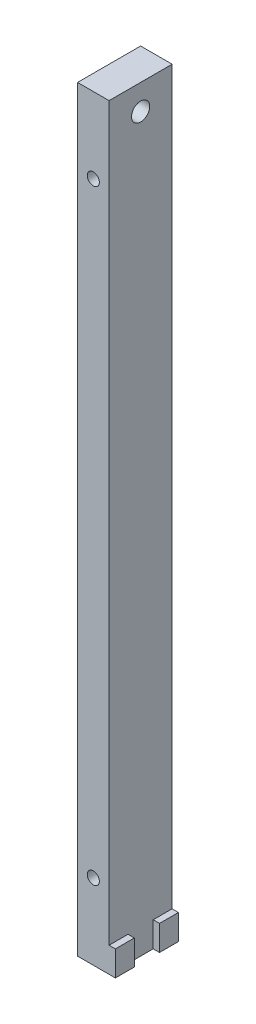
ISO-10303-21;
HEADER;
FILE_DESCRIPTION(('STEP AP214'),'2;1');
FILE_NAME('part.step','',(''),(''),'','','');
FILE_SCHEMA(('AUTOMOTIVE_DESIGN { 1 0 10303 214 1 1 1 1 }'));
ENDSEC;
DATA;
#1=APPLICATION_CONTEXT('core data for automotive mechanical design processes');
#2=APPLICATION_PROTOCOL_DEFINITION('international standard','automotive_design',2000,#1);
#3=PRODUCT_CONTEXT('',#1,'mechanical');
#4=PRODUCT('Part','Part','',(#3));
#5=PRODUCT_RELATED_PRODUCT_CATEGORY('part','',(#4));
#6=PRODUCT_DEFINITION_FORMATION('','',#4);
#7=PRODUCT_DEFINITION_CONTEXT('part definition',#1,'design');
#8=PRODUCT_DEFINITION('design','',#6,#7);
#9=PRODUCT_DEFINITION_SHAPE('','',#8);
#10=(LENGTH_UNIT() NAMED_UNIT(*) SI_UNIT(.MILLI.,.METRE.));
#11=(NAMED_UNIT(*) PLANE_ANGLE_UNIT() SI_UNIT($,.RADIAN.));
#12=(NAMED_UNIT(*) SI_UNIT($,.STERADIAN.) SOLID_ANGLE_UNIT());
#13=UNCERTAINTY_MEASURE_WITH_UNIT(LENGTH_MEASURE(1.E-05),#10,'distance_accuracy_value','');
#14=(GEOMETRIC_REPRESENTATION_CONTEXT(3) GLOBAL_UNCERTAINTY_ASSIGNED_CONTEXT((#13)) GLOBAL_UNIT_ASSIGNED_CONTEXT((#10,
#11,#12)) REPRESENTATION_CONTEXT('',''));
#15=CARTESIAN_POINT('',(0.,0.,0.));
#16=DIRECTION('',(0.,0.,1.));
#17=DIRECTION('',(1.,0.,0.));
#18=AXIS2_PLACEMENT_3D('',#15,#16,#17);
#19=CARTESIAN_POINT('',(9.525,190.5,15.875));
#20=DIRECTION('',(-1.,0.,0.));
#21=DIRECTION('',(0.,0.,1.));
#22=AXIS2_PLACEMENT_3D('',#19,#20,#21);
#23=PLANE('',#22);
#24=DIRECTION('',(0.,0.,1.));
#25=VECTOR('',#24,1.);
#26=CARTESIAN_POINT('',(9.525,6.35,15.875));
#27=LINE('',#26,#25);
#28=CARTESIAN_POINT('',(9.525,6.35,11.1125));
#29=VERTEX_POINT('',#28);
#30=CARTESIAN_POINT('',(9.525,6.35,15.875));
#31=VERTEX_POINT('',#30);
#32=EDGE_CURVE('E188',#29,#31,#27,.T.);
#33=ORIENTED_EDGE('',*,*,#32,.T.);
#34=DIRECTION('',(0.,-1.,0.));
#35=VECTOR('',#34,1.);
#36=CARTESIAN_POINT('',(9.525,190.5,15.875));
#37=LINE('',#36,#35);
#38=CARTESIAN_POINT('',(9.525,0.,15.875));
#39=VERTEX_POINT('',#38);
#40=EDGE_CURVE('E167',#31,#39,#37,.T.);
#41=ORIENTED_EDGE('',*,*,#40,.T.);
#42=DIRECTION('',(0.,0.,-1.));
#43=VECTOR('',#42,1.);
#44=CARTESIAN_POINT('',(9.525,0.,15.875));
#45=LINE('',#44,#43);
#46=CARTESIAN_POINT('',(9.525,0.,11.1125));
#47=VERTEX_POINT('',#46);
#48=EDGE_CURVE('E142',#39,#47,#45,.T.);
#49=ORIENTED_EDGE('',*,*,#48,.T.);
#50=DIRECTION('',(0.,-1.,0.));
#51=VECTOR('',#50,1.);
#52=CARTESIAN_POINT('',(9.525,190.5,11.1125));
#53=LINE('',#52,#51);
#54=EDGE_CURVE('E164',#29,#47,#53,.T.);
#55=ORIENTED_EDGE('',*,*,#54,.F.);
#56=EDGE_LOOP('',(#33,#41,#49,#55));
#57=FACE_BOUND('',#56,.T.);
#58=ADVANCED_FACE('F42',(#57),#23,.F.);
#59=CARTESIAN_POINT('',(9.525,190.5,11.1125));
#60=DIRECTION('',(0.,0.,1.));
#61=DIRECTION('',(1.,0.,0.));
#62=AXIS2_PLACEMENT_3D('',#59,#60,#61);
#63=PLANE('',#62);
#64=DIRECTION('',(-1.,0.,0.));
#65=VECTOR('',#64,1.);
#66=CARTESIAN_POINT('',(9.525,6.34999999999999,11.1125));
#67=LINE('',#66,#65);
#68=CARTESIAN_POINT('',(7.9375,6.35,11.1125));
#69=VERTEX_POINT('',#68);
#70=EDGE_CURVE('E127',#29,#69,#67,.T.);
#71=ORIENTED_EDGE('',*,*,#70,.F.);
#72=ORIENTED_EDGE('',*,*,#54,.T.);
#73=DIRECTION('',(-1.,0.,0.));
#74=VECTOR('',#73,1.);
#75=CARTESIAN_POINT('',(9.525,0.,11.1125));
#76=LINE('',#75,#74);
#77=CARTESIAN_POINT('',(7.9375,0.,11.1125));
#78=VERTEX_POINT('',#77);
#79=EDGE_CURVE('E146',#47,#78,#76,.T.);
#80=ORIENTED_EDGE('',*,*,#79,.T.);
#81=DIRECTION('',(0.,-1.,0.));
#82=VECTOR('',#81,1.);
#83=CARTESIAN_POINT('',(7.9375,190.5,11.1125));
#84=LINE('',#83,#82);
#85=EDGE_CURVE('E161',#69,#78,#84,.T.);
#86=ORIENTED_EDGE('',*,*,#85,.F.);
#87=EDGE_LOOP('',(#71,#72,#80,#86));
#88=FACE_BOUND('',#87,.T.);
#89=ADVANCED_FACE('F215',(#88),#63,.F.);
#90=CARTESIAN_POINT('',(7.9375,190.5,4.7625));
#91=DIRECTION('',(0.,0.,-1.));
#92=DIRECTION('',(-1.,0.,0.));
#93=AXIS2_PLACEMENT_3D('',#90,#91,#92);
#94=PLANE('',#93);
#95=DIRECTION('',(1.,0.,0.));
#96=VECTOR('',#95,1.);
#97=CARTESIAN_POINT('',(7.9375,6.34999999999999,4.7625));
#98=LINE('',#97,#96);
#99=CARTESIAN_POINT('',(7.9375,6.35,4.7625));
#100=VERTEX_POINT('',#99);
#101=CARTESIAN_POINT('',(9.525,6.35,4.7625));
#102=VERTEX_POINT('',#101);
#103=EDGE_CURVE('E134',#100,#102,#98,.T.);
#104=ORIENTED_EDGE('',*,*,#103,.F.);
#105=DIRECTION('',(0.,-1.,0.));
#106=VECTOR('',#105,1.);
#107=CARTESIAN_POINT('',(7.9375,190.5,4.7625));
#108=LINE('',#107,#106);
#109=CARTESIAN_POINT('',(7.9375,0.,4.7625));
#110=VERTEX_POINT('',#109);
#111=EDGE_CURVE('E158',#100,#110,#108,.T.);
#112=ORIENTED_EDGE('',*,*,#111,.T.);
#113=DIRECTION('',(1.,0.,0.));
#114=VECTOR('',#113,1.);
#115=CARTESIAN_POINT('',(7.9375,0.,4.7625));
#116=LINE('',#115,#114);
#117=CARTESIAN_POINT('',(9.525,0.,4.7625));
#118=VERTEX_POINT('',#117);
#119=EDGE_CURVE('E121',#110,#118,#116,.T.);
#120=ORIENTED_EDGE('',*,*,#119,.T.);
#121=DIRECTION('',(0.,-1.,0.));
#122=VECTOR('',#121,1.);
#123=CARTESIAN_POINT('',(9.525,190.5,4.7625));
#124=LINE('',#123,#122);
#125=EDGE_CURVE('E110',#102,#118,#124,.T.);
#126=ORIENTED_EDGE('',*,*,#125,.F.);
#127=EDGE_LOOP('',(#104,#112,#120,#126));
#128=FACE_BOUND('',#127,.T.);
#129=ADVANCED_FACE('F272',(#128),#94,.F.);
#130=CARTESIAN_POINT('',(9.525,190.5,4.7625));
#131=DIRECTION('',(-1.,0.,0.));
#132=DIRECTION('',(0.,0.,1.));
#133=AXIS2_PLACEMENT_3D('',#130,#131,#132);
#134=PLANE('',#133);
#135=CARTESIAN_POINT('',(9.525,6.35,0.));
#136=VERTEX_POINT('',#135);
#137=EDGE_CURVE('E211',#136,#102,#27,.T.);
#138=ORIENTED_EDGE('',*,*,#137,.T.);
#139=ORIENTED_EDGE('',*,*,#125,.T.);
#140=DIRECTION('',(0.,0.,-1.));
#141=VECTOR('',#140,1.);
#142=CARTESIAN_POINT('',(9.525,0.,4.7625));
#143=LINE('',#142,#141);
#144=CARTESIAN_POINT('',(9.525,0.,0.));
#145=VERTEX_POINT('',#144);
#146=EDGE_CURVE('E113',#118,#145,#143,.T.);
#147=ORIENTED_EDGE('',*,*,#146,.T.);
#148=DIRECTION('',(0.,-1.,0.));
#149=VECTOR('',#148,1.);
#150=CARTESIAN_POINT('',(9.525,190.5,0.));
#151=LINE('',#150,#149);
#152=EDGE_CURVE('E97',#136,#145,#151,.T.);
#153=ORIENTED_EDGE('',*,*,#152,.F.);
#154=EDGE_LOOP('',(#138,#139,#147,#153));
#155=FACE_BOUND('',#154,.T.);
#156=ADVANCED_FACE('F114',(#155),#134,.F.);
#157=CARTESIAN_POINT('',(9.525,190.5,0.));
#158=DIRECTION('',(0.,0.,1.));
#159=DIRECTION('',(1.,0.,0.));
#160=AXIS2_PLACEMENT_3D('',#157,#158,#159);
#161=PLANE('',#160);
#162=CARTESIAN_POINT('',(3.96875,19.05,0.));
#163=DIRECTION('',(0.,0.,1.));
#164=DIRECTION('',(1.,0.,0.));
#165=AXIS2_PLACEMENT_3D('',#162,#163,#164);
#166=CIRCLE('',#165,1.524);
#167=CARTESIAN_POINT('',(5.49275,19.05,0.));
#168=VERTEX_POINT('',#167);
#169=EDGE_CURVE('E239',#168,#168,#166,.T.);
#170=ORIENTED_EDGE('',*,*,#169,.T.);
#171=EDGE_LOOP('',(#170));
#172=FACE_BOUND('',#171,.T.);
#173=CARTESIAN_POINT('',(3.96875,171.45,0.));
#174=DIRECTION('',(0.,0.,1.));
#175=DIRECTION('',(1.,0.,0.));
#176=AXIS2_PLACEMENT_3D('',#173,#174,#175);
#177=CIRCLE('',#176,1.524);
#178=CARTESIAN_POINT('',(5.49275,171.45,0.));
#179=VERTEX_POINT('',#178);
#180=EDGE_CURVE('E311',#179,#179,#177,.T.);
#181=ORIENTED_EDGE('',*,*,#180,.T.);
#182=EDGE_LOOP('',(#181));
#183=FACE_BOUND('',#182,.T.);
#184=DIRECTION('',(-1.,0.,0.));
#185=VECTOR('',#184,1.);
#186=CARTESIAN_POINT('',(9.525,190.5,0.));
#187=LINE('',#186,#185);
#188=CARTESIAN_POINT('',(7.9375,190.5,0.));
#189=VERTEX_POINT('',#188);
#190=CARTESIAN_POINT('',(0.,190.5,0.));
#191=VERTEX_POINT('',#190);
#192=EDGE_CURVE('E120',#189,#191,#187,.T.);
#193=ORIENTED_EDGE('',*,*,#192,.F.);
#194=DIRECTION('',(0.,1.,0.));
#195=VECTOR('',#194,1.);
#196=CARTESIAN_POINT('',(7.9375,-15.9541775485294,0.));
#197=LINE('',#196,#195);
#198=CARTESIAN_POINT('',(7.9375,6.35,0.));
#199=VERTEX_POINT('',#198);
#200=EDGE_CURVE('E236',#199,#189,#197,.T.);
#201=ORIENTED_EDGE('',*,*,#200,.F.);
#202=DIRECTION('',(1.,0.,0.));
#203=VECTOR('',#202,1.);
#204=CARTESIAN_POINT('',(9.525,6.35,0.));
#205=LINE('',#204,#203);
#206=EDGE_CURVE('E106',#199,#136,#205,.T.);
#207=ORIENTED_EDGE('',*,*,#206,.T.);
#208=ORIENTED_EDGE('',*,*,#152,.T.);
#209=DIRECTION('',(-1.,0.,0.));
#210=VECTOR('',#209,1.);
#211=CARTESIAN_POINT('',(9.525,0.,0.));
#212=LINE('',#211,#210);
#213=CARTESIAN_POINT('',(0.,0.,0.));
#214=VERTEX_POINT('',#213);
#215=EDGE_CURVE('E102',#145,#214,#212,.T.);
#216=ORIENTED_EDGE('',*,*,#215,.T.);
#217=DIRECTION('',(0.,-1.,0.));
#218=VECTOR('',#217,1.);
#219=CARTESIAN_POINT('',(0.,190.5,0.));
#220=LINE('',#219,#218);
#221=EDGE_CURVE('E12',#191,#214,#220,.T.);
#222=ORIENTED_EDGE('',*,*,#221,.F.);
#223=EDGE_LOOP('',(#193,#201,#207,#208,#216,#222));
#224=FACE_BOUND('',#223,.T.);
#225=ADVANCED_FACE('F44',(#172,#183,#224),#161,.F.);
#226=CARTESIAN_POINT('',(0.,190.5,0.));
#227=DIRECTION('',(1.,0.,0.));
#228=DIRECTION('',(0.,0.,-1.));
#229=AXIS2_PLACEMENT_3D('',#226,#227,#228);
#230=PLANE('',#229);
#231=CARTESIAN_POINT('',(0.,184.15,7.9375));
#232=DIRECTION('',(-1.,0.,0.));
#233=DIRECTION('',(0.,0.,1.));
#234=AXIS2_PLACEMENT_3D('',#231,#232,#233);
#235=CIRCLE('',#234,2.286);
#236=CARTESIAN_POINT('',(0.,184.15,10.2235));
#237=VERTEX_POINT('',#236);
#238=EDGE_CURVE('E304',#237,#237,#235,.T.);
#239=ORIENTED_EDGE('',*,*,#238,.F.);
#240=EDGE_LOOP('',(#239));
#241=FACE_BOUND('',#240,.T.);
#242=DIRECTION('',(0.,0.,1.));
#243=VECTOR('',#242,1.);
#244=CARTESIAN_POINT('',(0.,0.,0.));
#245=LINE('',#244,#243);
#246=CARTESIAN_POINT('',(0.,0.,15.875));
#247=VERTEX_POINT('',#246);
#248=EDGE_CURVE('E125',#214,#247,#245,.T.);
#249=ORIENTED_EDGE('',*,*,#248,.T.);
#250=DIRECTION('',(0.,-1.,0.));
#251=VECTOR('',#250,1.);
#252=CARTESIAN_POINT('',(0.,190.5,15.875));
#253=LINE('',#252,#251);
#254=CARTESIAN_POINT('',(0.,190.5,15.875));
#255=VERTEX_POINT('',#254);
#256=EDGE_CURVE('E52',#255,#247,#253,.T.);
#257=ORIENTED_EDGE('',*,*,#256,.F.);
#258=DIRECTION('',(0.,0.,1.));
#259=VECTOR('',#258,1.);
#260=CARTESIAN_POINT('',(0.,190.5,0.));
#261=LINE('',#260,#259);
#262=EDGE_CURVE('E65',#191,#255,#261,.T.);
#263=ORIENTED_EDGE('',*,*,#262,.F.);
#264=ORIENTED_EDGE('',*,*,#221,.T.);
#265=EDGE_LOOP('',(#249,#257,#263,#264));
#266=FACE_BOUND('',#265,.T.);
#267=ADVANCED_FACE('F256',(#241,#266),#230,.F.);
#268=CARTESIAN_POINT('',(0.,190.5,15.875));
#269=DIRECTION('',(0.,0.,-1.));
#270=DIRECTION('',(-1.,0.,0.));
#271=AXIS2_PLACEMENT_3D('',#268,#269,#270);
#272=PLANE('',#271);
#273=CARTESIAN_POINT('',(3.96875,19.05,15.875));
#274=DIRECTION('',(0.,0.,1.));
#275=DIRECTION('',(1.,0.,0.));
#276=AXIS2_PLACEMENT_3D('',#273,#274,#275);
#277=CIRCLE('',#276,1.524);
#278=CARTESIAN_POINT('',(5.49275,19.05,15.875));
#279=VERTEX_POINT('',#278);
#280=EDGE_CURVE('E317',#279,#279,#277,.T.);
#281=ORIENTED_EDGE('',*,*,#280,.F.);
#282=EDGE_LOOP('',(#281));
#283=FACE_BOUND('',#282,.T.);
#284=CARTESIAN_POINT('',(3.96875,171.45,15.875));
#285=DIRECTION('',(0.,0.,1.));
#286=DIRECTION('',(1.,0.,0.));
#287=AXIS2_PLACEMENT_3D('',#284,#285,#286);
#288=CIRCLE('',#287,1.524);
#289=CARTESIAN_POINT('',(5.49275,171.45,15.875));
#290=VERTEX_POINT('',#289);
#291=EDGE_CURVE('E230',#290,#290,#288,.T.);
#292=ORIENTED_EDGE('',*,*,#291,.F.);
#293=EDGE_LOOP('',(#292));
#294=FACE_BOUND('',#293,.T.);
#295=DIRECTION('',(-1.,0.,0.));
#296=VECTOR('',#295,1.);
#297=CARTESIAN_POINT('',(9.525,6.35,15.875));
#298=LINE('',#297,#296);
#299=CARTESIAN_POINT('',(7.9375,6.35,15.875));
#300=VERTEX_POINT('',#299);
#301=EDGE_CURVE('E191',#31,#300,#298,.T.);
#302=ORIENTED_EDGE('',*,*,#301,.T.);
#303=DIRECTION('',(0.,1.,0.));
#304=VECTOR('',#303,1.);
#305=CARTESIAN_POINT('',(7.9375,-15.9541775485294,15.875));
#306=LINE('',#305,#304);
#307=CARTESIAN_POINT('',(7.9375,190.5,15.875));
#308=VERTEX_POINT('',#307);
#309=EDGE_CURVE('E221',#300,#308,#306,.T.);
#310=ORIENTED_EDGE('',*,*,#309,.T.);
#311=DIRECTION('',(1.,0.,0.));
#312=VECTOR('',#311,1.);
#313=CARTESIAN_POINT('',(0.,190.5,15.875));
#314=LINE('',#313,#312);
#315=EDGE_CURVE('E179',#255,#308,#314,.T.);
#316=ORIENTED_EDGE('',*,*,#315,.F.);
#317=ORIENTED_EDGE('',*,*,#256,.T.);
#318=DIRECTION('',(1.,0.,0.));
#319=VECTOR('',#318,1.);
#320=CARTESIAN_POINT('',(0.,0.,15.875));
#321=LINE('',#320,#319);
#322=EDGE_CURVE('E131',#247,#39,#321,.T.);
#323=ORIENTED_EDGE('',*,*,#322,.T.);
#324=ORIENTED_EDGE('',*,*,#40,.F.);
#325=EDGE_LOOP('',(#302,#310,#316,#317,#323,#324));
#326=FACE_BOUND('',#325,.T.);
#327=ADVANCED_FACE('F175',(#283,#294,#326),#272,.F.);
#328=CARTESIAN_POINT('',(7.9375,190.5,11.1125));
#329=DIRECTION('',(-1.,0.,0.));
#330=DIRECTION('',(0.,0.,1.));
#331=AXIS2_PLACEMENT_3D('',#328,#329,#330);
#332=PLANE('',#331);
#333=CARTESIAN_POINT('',(7.9375,184.15,7.9375));
#334=DIRECTION('',(-1.,0.,0.));
#335=DIRECTION('',(0.,0.,1.));
#336=AXIS2_PLACEMENT_3D('',#333,#334,#335);
#337=CIRCLE('',#336,2.286);
#338=CARTESIAN_POINT('',(7.9375,184.15,10.2235));
#339=VERTEX_POINT('',#338);
#340=EDGE_CURVE('E46',#339,#339,#337,.T.);
#341=ORIENTED_EDGE('',*,*,#340,.T.);
#342=EDGE_LOOP('',(#341));
#343=FACE_BOUND('',#342,.T.);
#344=DIRECTION('',(0.,0.,-1.));
#345=VECTOR('',#344,1.);
#346=CARTESIAN_POINT('',(7.9375,190.5,11.1125));
#347=LINE('',#346,#345);
#348=EDGE_CURVE('E59',#308,#189,#347,.T.);
#349=ORIENTED_EDGE('',*,*,#348,.F.);
#350=ORIENTED_EDGE('',*,*,#309,.F.);
#351=DIRECTION('',(0.,0.,-1.));
#352=VECTOR('',#351,1.);
#353=CARTESIAN_POINT('',(7.9375,6.35,15.875));
#354=LINE('',#353,#352);
#355=EDGE_CURVE('E220',#300,#69,#354,.T.);
#356=ORIENTED_EDGE('',*,*,#355,.T.);
#357=ORIENTED_EDGE('',*,*,#85,.T.);
#358=DIRECTION('',(0.,0.,-1.));
#359=VECTOR('',#358,1.);
#360=CARTESIAN_POINT('',(7.9375,0.,11.1125));
#361=LINE('',#360,#359);
#362=EDGE_CURVE('E150',#78,#110,#361,.T.);
#363=ORIENTED_EDGE('',*,*,#362,.T.);
#364=ORIENTED_EDGE('',*,*,#111,.F.);
#365=EDGE_CURVE('E223',#100,#199,#354,.T.);
#366=ORIENTED_EDGE('',*,*,#365,.T.);
#367=ORIENTED_EDGE('',*,*,#200,.T.);
#368=EDGE_LOOP('',(#349,#350,#356,#357,#363,#364,#366,#367));
#369=FACE_BOUND('',#368,.T.);
#370=ADVANCED_FACE('F217',(#343,#369),#332,.F.);
#371=CARTESIAN_POINT('',(0.,190.5,0.));
#372=DIRECTION('',(0.,1.,0.));
#373=DIRECTION('',(0.,0.,1.));
#374=AXIS2_PLACEMENT_3D('',#371,#372,#373);
#375=PLANE('',#374);
#376=ORIENTED_EDGE('',*,*,#348,.T.);
#377=ORIENTED_EDGE('',*,*,#192,.T.);
#378=ORIENTED_EDGE('',*,*,#262,.T.);
#379=ORIENTED_EDGE('',*,*,#315,.T.);
#380=EDGE_LOOP('',(#376,#377,#378,#379));
#381=FACE_BOUND('',#380,.T.);
#382=ADVANCED_FACE('F250',(#381),#375,.T.);
#383=CARTESIAN_POINT('',(0.,0.,0.));
#384=DIRECTION('',(0.,1.,0.));
#385=DIRECTION('',(0.,0.,1.));
#386=AXIS2_PLACEMENT_3D('',#383,#384,#385);
#387=PLANE('',#386);
#388=ORIENTED_EDGE('',*,*,#215,.F.);
#389=ORIENTED_EDGE('',*,*,#146,.F.);
#390=ORIENTED_EDGE('',*,*,#119,.F.);
#391=ORIENTED_EDGE('',*,*,#362,.F.);
#392=ORIENTED_EDGE('',*,*,#79,.F.);
#393=ORIENTED_EDGE('',*,*,#48,.F.);
#394=ORIENTED_EDGE('',*,*,#322,.F.);
#395=ORIENTED_EDGE('',*,*,#248,.F.);
#396=EDGE_LOOP('',(#388,#389,#390,#391,#392,#393,#394,#395));
#397=FACE_BOUND('',#396,.T.);
#398=ADVANCED_FACE('F123',(#397),#387,.F.);
#399=CARTESIAN_POINT('',(0.,6.35,0.));
#400=DIRECTION('',(0.,1.,0.));
#401=DIRECTION('',(0.,0.,1.));
#402=AXIS2_PLACEMENT_3D('',#399,#400,#401);
#403=PLANE('',#402);
#404=ORIENTED_EDGE('',*,*,#70,.T.);
#405=ORIENTED_EDGE('',*,*,#355,.F.);
#406=ORIENTED_EDGE('',*,*,#301,.F.);
#407=ORIENTED_EDGE('',*,*,#32,.F.);
#408=EDGE_LOOP('',(#404,#405,#406,#407));
#409=FACE_BOUND('',#408,.T.);
#410=ADVANCED_FACE('F208',(#409),#403,.T.);
#411=ORIENTED_EDGE('',*,*,#103,.T.);
#412=ORIENTED_EDGE('',*,*,#137,.F.);
#413=ORIENTED_EDGE('',*,*,#206,.F.);
#414=ORIENTED_EDGE('',*,*,#365,.F.);
#415=EDGE_LOOP('',(#411,#412,#413,#414));
#416=FACE_BOUND('',#415,.T.);
#417=ADVANCED_FACE('F255',(#416),#403,.T.);
#418=CARTESIAN_POINT('',(3.96875,171.45,0.));
#419=DIRECTION('',(0.,0.,1.));
#420=DIRECTION('',(1.,0.,0.));
#421=AXIS2_PLACEMENT_3D('',#418,#419,#420);
#422=CYLINDRICAL_SURFACE('',#421,1.524);
#423=ORIENTED_EDGE('',*,*,#180,.F.);
#424=EDGE_LOOP('',(#423));
#425=FACE_BOUND('',#424,.T.);
#426=ORIENTED_EDGE('',*,*,#291,.T.);
#427=EDGE_LOOP('',(#426));
#428=FACE_BOUND('',#427,.T.);
#429=ADVANCED_FACE('F289',(#425,#428),#422,.F.);
#430=CARTESIAN_POINT('',(3.96875,19.05,0.));
#431=DIRECTION('',(0.,0.,1.));
#432=DIRECTION('',(1.,0.,0.));
#433=AXIS2_PLACEMENT_3D('',#430,#431,#432);
#434=CYLINDRICAL_SURFACE('',#433,1.524);
#435=ORIENTED_EDGE('',*,*,#169,.F.);
#436=EDGE_LOOP('',(#435));
#437=FACE_BOUND('',#436,.T.);
#438=ORIENTED_EDGE('',*,*,#280,.T.);
#439=EDGE_LOOP('',(#438));
#440=FACE_BOUND('',#439,.T.);
#441=ADVANCED_FACE('F292',(#437,#440),#434,.F.);
#442=CARTESIAN_POINT('',(9.525,184.15,7.9375));
#443=DIRECTION('',(-1.,0.,0.));
#444=DIRECTION('',(0.,0.,1.));
#445=AXIS2_PLACEMENT_3D('',#442,#443,#444);
#446=CYLINDRICAL_SURFACE('',#445,2.286);
#447=ORIENTED_EDGE('',*,*,#238,.T.);
#448=EDGE_LOOP('',(#447));
#449=FACE_BOUND('',#448,.T.);
#450=ORIENTED_EDGE('',*,*,#340,.F.);
#451=EDGE_LOOP('',(#450));
#452=FACE_BOUND('',#451,.T.);
#453=ADVANCED_FACE('F296',(#449,#452),#446,.F.);
#454=CLOSED_SHELL('',(#58,#89,#129,#156,#225,#267,#327,#370,#382,#398,#410,#417,#429,#441,#453));
#455=MANIFOLD_SOLID_BREP('B2',#454);
#456=ADVANCED_BREP_SHAPE_REPRESENTATION('',(#18,#455),#14);
#457=SHAPE_DEFINITION_REPRESENTATION(#9,#456);
ENDSEC;
END-ISO-10303-21;
